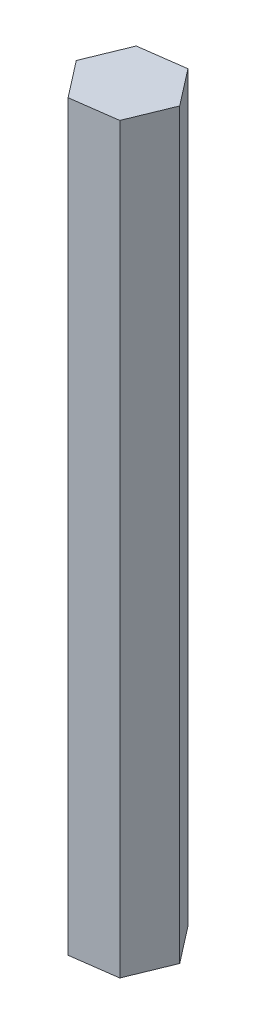
ISO-10303-21;
HEADER;
FILE_DESCRIPTION(('STEP AP214'),'2;1');
FILE_NAME('part.step','',(''),(''),'','','');
FILE_SCHEMA(('AUTOMOTIVE_DESIGN { 1 0 10303 214 1 1 1 1 }'));
ENDSEC;
DATA;
#1=APPLICATION_CONTEXT('core data for automotive mechanical design processes');
#2=APPLICATION_PROTOCOL_DEFINITION('international standard','automotive_design',2000,#1);
#3=PRODUCT_CONTEXT('',#1,'mechanical');
#4=PRODUCT('Part','Part','',(#3));
#5=PRODUCT_RELATED_PRODUCT_CATEGORY('part','',(#4));
#6=PRODUCT_DEFINITION_FORMATION('','',#4);
#7=PRODUCT_DEFINITION_CONTEXT('part definition',#1,'design');
#8=PRODUCT_DEFINITION('design','',#6,#7);
#9=PRODUCT_DEFINITION_SHAPE('','',#8);
#10=(LENGTH_UNIT() NAMED_UNIT(*) SI_UNIT(.MILLI.,.METRE.));
#11=(NAMED_UNIT(*) PLANE_ANGLE_UNIT() SI_UNIT($,.RADIAN.));
#12=(NAMED_UNIT(*) SI_UNIT($,.STERADIAN.) SOLID_ANGLE_UNIT());
#13=UNCERTAINTY_MEASURE_WITH_UNIT(LENGTH_MEASURE(1.E-05),#10,'distance_accuracy_value','');
#14=(GEOMETRIC_REPRESENTATION_CONTEXT(3) GLOBAL_UNCERTAINTY_ASSIGNED_CONTEXT((#13)) GLOBAL_UNIT_ASSIGNED_CONTEXT((#10,
#11,#12)) REPRESENTATION_CONTEXT('',''));
#15=CARTESIAN_POINT('',(0.,0.,0.));
#16=DIRECTION('',(0.,0.,1.));
#17=DIRECTION('',(1.,0.,0.));
#18=AXIS2_PLACEMENT_3D('',#15,#16,#17);
#19=CARTESIAN_POINT('',(-2.08342955409643,44.45,5.08932179107566));
#20=DIRECTION('',(-0.134628622358067,0.,-0.990896126767064));
#21=DIRECTION('',(-0.990896126767064,0.,0.134628622358067));
#22=AXIS2_PLACEMENT_3D('',#19,#20,#21);
#23=PLANE('',#22);
#24=DIRECTION('',(0.990896126767064,0.,-0.134628622358067));
#25=VECTOR('',#24,1.);
#26=CARTESIAN_POINT('',(-2.08342955409643,-44.45,5.08932179107566));
#27=LINE('',#26,#25);
#28=CARTESIAN_POINT('',(-2.08342955409643,-44.45,5.08932179107566));
#29=VERTEX_POINT('',#28);
#30=CARTESIAN_POINT('',(3.36576718205702,-44.45,4.34896381638063));
#31=VERTEX_POINT('',#30);
#32=EDGE_CURVE('E117',#29,#31,#27,.T.);
#33=ORIENTED_EDGE('',*,*,#32,.T.);
#34=DIRECTION('',(0.,-1.,0.));
#35=VECTOR('',#34,1.);
#36=CARTESIAN_POINT('',(3.36576718205702,44.45,4.34896381638063));
#37=LINE('',#36,#35);
#38=CARTESIAN_POINT('',(3.36576718205702,44.45,4.34896381638063));
#39=VERTEX_POINT('',#38);
#40=EDGE_CURVE('E11',#39,#31,#37,.T.);
#41=ORIENTED_EDGE('',*,*,#40,.F.);
#42=DIRECTION('',(0.990896126767064,0.,-0.134628622358067));
#43=VECTOR('',#42,1.);
#44=CARTESIAN_POINT('',(-2.08342955409643,44.45,5.08932179107566));
#45=LINE('',#44,#43);
#46=CARTESIAN_POINT('',(-2.08342955409643,44.45,5.08932179107566));
#47=VERTEX_POINT('',#46);
#48=EDGE_CURVE('E127',#47,#39,#45,.T.);
#49=ORIENTED_EDGE('',*,*,#48,.F.);
#50=DIRECTION('',(0.,-1.,0.));
#51=VECTOR('',#50,1.);
#52=CARTESIAN_POINT('',(-2.08342955409643,44.45,5.08932179107566));
#53=LINE('',#52,#51);
#54=EDGE_CURVE('E113',#47,#29,#53,.T.);
#55=ORIENTED_EDGE('',*,*,#54,.T.);
#56=EDGE_LOOP('',(#33,#41,#49,#55));
#57=FACE_BOUND('',#56,.T.);
#58=ADVANCED_FACE('F33',(#57),#23,.F.);
#59=CARTESIAN_POINT('',(3.36576718205702,44.45,4.34896381638063));
#60=DIRECTION('',(-0.925455529470916,0.,-0.378856256344944));
#61=DIRECTION('',(-0.378856256344944,0.,0.925455529470916));
#62=AXIS2_PLACEMENT_3D('',#59,#60,#61);
#63=PLANE('',#62);
#64=DIRECTION('',(0.378856256344944,0.,-0.925455529470916));
#65=VECTOR('',#64,1.);
#66=CARTESIAN_POINT('',(3.36576718205702,-44.45,4.34896381638063));
#67=LINE('',#66,#65);
#68=CARTESIAN_POINT('',(5.44919673615346,-44.45,-0.740357974695031));
#69=VERTEX_POINT('',#68);
#70=EDGE_CURVE('E120',#31,#69,#67,.T.);
#71=ORIENTED_EDGE('',*,*,#70,.T.);
#72=DIRECTION('',(0.,-1.,0.));
#73=VECTOR('',#72,1.);
#74=CARTESIAN_POINT('',(5.44919673615346,44.45,-0.740357974695031));
#75=LINE('',#74,#73);
#76=CARTESIAN_POINT('',(5.44919673615346,44.45,-0.740357974695031));
#77=VERTEX_POINT('',#76);
#78=EDGE_CURVE('E41',#77,#69,#75,.T.);
#79=ORIENTED_EDGE('',*,*,#78,.F.);
#80=DIRECTION('',(0.378856256344944,0.,-0.925455529470916));
#81=VECTOR('',#80,1.);
#82=CARTESIAN_POINT('',(3.36576718205702,44.45,4.34896381638063));
#83=LINE('',#82,#81);
#84=EDGE_CURVE('E86',#39,#77,#83,.T.);
#85=ORIENTED_EDGE('',*,*,#84,.F.);
#86=ORIENTED_EDGE('',*,*,#40,.T.);
#87=EDGE_LOOP('',(#71,#79,#85,#86));
#88=FACE_BOUND('',#87,.T.);
#89=ADVANCED_FACE('F151',(#88),#63,.F.);
#90=CARTESIAN_POINT('',(5.44919673615346,44.45,-0.740357974695031));
#91=DIRECTION('',(-0.790826907112849,0.,0.61203987042212));
#92=DIRECTION('',(0.61203987042212,0.,0.790826907112849));
#93=AXIS2_PLACEMENT_3D('',#90,#91,#92);
#94=PLANE('',#93);
#95=DIRECTION('',(-0.61203987042212,0.,-0.790826907112849));
#96=VECTOR('',#95,1.);
#97=CARTESIAN_POINT('',(5.44919673615346,-44.45,-0.740357974695031));
#98=LINE('',#97,#96);
#99=CARTESIAN_POINT('',(2.08342955409643,-44.45,-5.08932179107566));
#100=VERTEX_POINT('',#99);
#101=EDGE_CURVE('E122',#69,#100,#98,.T.);
#102=ORIENTED_EDGE('',*,*,#101,.T.);
#103=DIRECTION('',(0.,-1.,0.));
#104=VECTOR('',#103,1.);
#105=CARTESIAN_POINT('',(2.08342955409643,44.45,-5.08932179107566));
#106=LINE('',#105,#104);
#107=CARTESIAN_POINT('',(2.08342955409643,44.45,-5.08932179107566));
#108=VERTEX_POINT('',#107);
#109=EDGE_CURVE('E108',#108,#100,#106,.T.);
#110=ORIENTED_EDGE('',*,*,#109,.F.);
#111=DIRECTION('',(-0.61203987042212,0.,-0.790826907112849));
#112=VECTOR('',#111,1.);
#113=CARTESIAN_POINT('',(5.44919673615346,44.45,-0.740357974695031));
#114=LINE('',#113,#112);
#115=EDGE_CURVE('E99',#77,#108,#114,.T.);
#116=ORIENTED_EDGE('',*,*,#115,.F.);
#117=ORIENTED_EDGE('',*,*,#78,.T.);
#118=EDGE_LOOP('',(#102,#110,#116,#117));
#119=FACE_BOUND('',#118,.T.);
#120=ADVANCED_FACE('F133',(#119),#94,.F.);
#121=CARTESIAN_POINT('',(2.08342955409643,44.45,-5.08932179107566));
#122=DIRECTION('',(0.134628622358067,0.,0.990896126767064));
#123=DIRECTION('',(0.990896126767064,0.,-0.134628622358067));
#124=AXIS2_PLACEMENT_3D('',#121,#122,#123);
#125=PLANE('',#124);
#126=DIRECTION('',(-0.990896126767064,0.,0.134628622358067));
#127=VECTOR('',#126,1.);
#128=CARTESIAN_POINT('',(2.08342955409643,-44.45,-5.08932179107566));
#129=LINE('',#128,#127);
#130=CARTESIAN_POINT('',(-3.36576718205702,-44.45,-4.34896381638063));
#131=VERTEX_POINT('',#130);
#132=EDGE_CURVE('E107',#100,#131,#129,.T.);
#133=ORIENTED_EDGE('',*,*,#132,.T.);
#134=DIRECTION('',(0.,-1.,0.));
#135=VECTOR('',#134,1.);
#136=CARTESIAN_POINT('',(-3.36576718205702,44.45,-4.34896381638063));
#137=LINE('',#136,#135);
#138=CARTESIAN_POINT('',(-3.36576718205702,44.45,-4.34896381638063));
#139=VERTEX_POINT('',#138);
#140=EDGE_CURVE('E104',#139,#131,#137,.T.);
#141=ORIENTED_EDGE('',*,*,#140,.F.);
#142=DIRECTION('',(-0.990896126767064,0.,0.134628622358067));
#143=VECTOR('',#142,1.);
#144=CARTESIAN_POINT('',(2.08342955409643,44.45,-5.08932179107566));
#145=LINE('',#144,#143);
#146=EDGE_CURVE('E93',#108,#139,#145,.T.);
#147=ORIENTED_EDGE('',*,*,#146,.F.);
#148=ORIENTED_EDGE('',*,*,#109,.T.);
#149=EDGE_LOOP('',(#133,#141,#147,#148));
#150=FACE_BOUND('',#149,.T.);
#151=ADVANCED_FACE('F105',(#150),#125,.F.);
#152=CARTESIAN_POINT('',(-3.36576718205702,44.45,-4.34896381638063));
#153=DIRECTION('',(0.925455529470916,0.,0.378856256344945));
#154=DIRECTION('',(0.378856256344945,0.,-0.925455529470916));
#155=AXIS2_PLACEMENT_3D('',#152,#153,#154);
#156=PLANE('',#155);
#157=DIRECTION('',(-0.378856256344945,0.,0.925455529470916));
#158=VECTOR('',#157,1.);
#159=CARTESIAN_POINT('',(-3.36576718205702,-44.45,-4.34896381638063));
#160=LINE('',#159,#158);
#161=CARTESIAN_POINT('',(-5.44919673615346,-44.45,0.740357974695031));
#162=VERTEX_POINT('',#161);
#163=EDGE_CURVE('E72',#131,#162,#160,.T.);
#164=ORIENTED_EDGE('',*,*,#163,.T.);
#165=DIRECTION('',(0.,-1.,0.));
#166=VECTOR('',#165,1.);
#167=CARTESIAN_POINT('',(-5.44919673615346,44.45,0.740357974695031));
#168=LINE('',#167,#166);
#169=CARTESIAN_POINT('',(-5.44919673615346,44.45,0.740357974695031));
#170=VERTEX_POINT('',#169);
#171=EDGE_CURVE('E109',#170,#162,#168,.T.);
#172=ORIENTED_EDGE('',*,*,#171,.F.);
#173=DIRECTION('',(-0.378856256344945,0.,0.925455529470916));
#174=VECTOR('',#173,1.);
#175=CARTESIAN_POINT('',(-3.36576718205702,44.45,-4.34896381638063));
#176=LINE('',#175,#174);
#177=EDGE_CURVE('E97',#139,#170,#176,.T.);
#178=ORIENTED_EDGE('',*,*,#177,.F.);
#179=ORIENTED_EDGE('',*,*,#140,.T.);
#180=EDGE_LOOP('',(#164,#172,#178,#179));
#181=FACE_BOUND('',#180,.T.);
#182=ADVANCED_FACE('F111',(#181),#156,.F.);
#183=CARTESIAN_POINT('',(-5.44919673615346,44.45,0.740357974695031));
#184=DIRECTION('',(0.790826907112849,0.,-0.612039870422119));
#185=DIRECTION('',(-0.61203987042212,0.,-0.790826907112849));
#186=AXIS2_PLACEMENT_3D('',#183,#184,#185);
#187=PLANE('',#186);
#188=DIRECTION('',(0.61203987042212,0.,0.790826907112849));
#189=VECTOR('',#188,1.);
#190=CARTESIAN_POINT('',(-5.44919673615346,-44.45,0.740357974695031));
#191=LINE('',#190,#189);
#192=EDGE_CURVE('E78',#162,#29,#191,.T.);
#193=ORIENTED_EDGE('',*,*,#192,.T.);
#194=ORIENTED_EDGE('',*,*,#54,.F.);
#195=DIRECTION('',(0.61203987042212,0.,0.790826907112849));
#196=VECTOR('',#195,1.);
#197=CARTESIAN_POINT('',(-5.44919673615346,44.45,0.740357974695031));
#198=LINE('',#197,#196);
#199=EDGE_CURVE('E49',#170,#47,#198,.T.);
#200=ORIENTED_EDGE('',*,*,#199,.F.);
#201=ORIENTED_EDGE('',*,*,#171,.T.);
#202=EDGE_LOOP('',(#193,#194,#200,#201));
#203=FACE_BOUND('',#202,.T.);
#204=ADVANCED_FACE('F140',(#203),#187,.F.);
#205=CARTESIAN_POINT('',(0.,44.45,0.));
#206=DIRECTION('',(0.,1.,0.));
#207=DIRECTION('',(0.,0.,1.));
#208=AXIS2_PLACEMENT_3D('',#205,#206,#207);
#209=PLANE('',#208);
#210=ORIENTED_EDGE('',*,*,#48,.T.);
#211=ORIENTED_EDGE('',*,*,#84,.T.);
#212=ORIENTED_EDGE('',*,*,#115,.T.);
#213=ORIENTED_EDGE('',*,*,#146,.T.);
#214=ORIENTED_EDGE('',*,*,#177,.T.);
#215=ORIENTED_EDGE('',*,*,#199,.T.);
#216=EDGE_LOOP('',(#210,#211,#212,#213,#214,#215));
#217=FACE_BOUND('',#216,.T.);
#218=ADVANCED_FACE('F95',(#217),#209,.T.);
#219=CARTESIAN_POINT('',(0.,-44.45,0.));
#220=DIRECTION('',(0.,1.,0.));
#221=DIRECTION('',(0.,0.,1.));
#222=AXIS2_PLACEMENT_3D('',#219,#220,#221);
#223=PLANE('',#222);
#224=ORIENTED_EDGE('',*,*,#32,.F.);
#225=ORIENTED_EDGE('',*,*,#192,.F.);
#226=ORIENTED_EDGE('',*,*,#163,.F.);
#227=ORIENTED_EDGE('',*,*,#132,.F.);
#228=ORIENTED_EDGE('',*,*,#101,.F.);
#229=ORIENTED_EDGE('',*,*,#70,.F.);
#230=EDGE_LOOP('',(#224,#225,#226,#227,#228,#229));
#231=FACE_BOUND('',#230,.T.);
#232=ADVANCED_FACE('F136',(#231),#223,.F.);
#233=CLOSED_SHELL('',(#58,#89,#120,#151,#182,#204,#218,#232));
#234=MANIFOLD_SOLID_BREP('B2',#233);
#235=ADVANCED_BREP_SHAPE_REPRESENTATION('',(#18,#234),#14);
#236=SHAPE_DEFINITION_REPRESENTATION(#9,#235);
ENDSEC;
END-ISO-10303-21;
